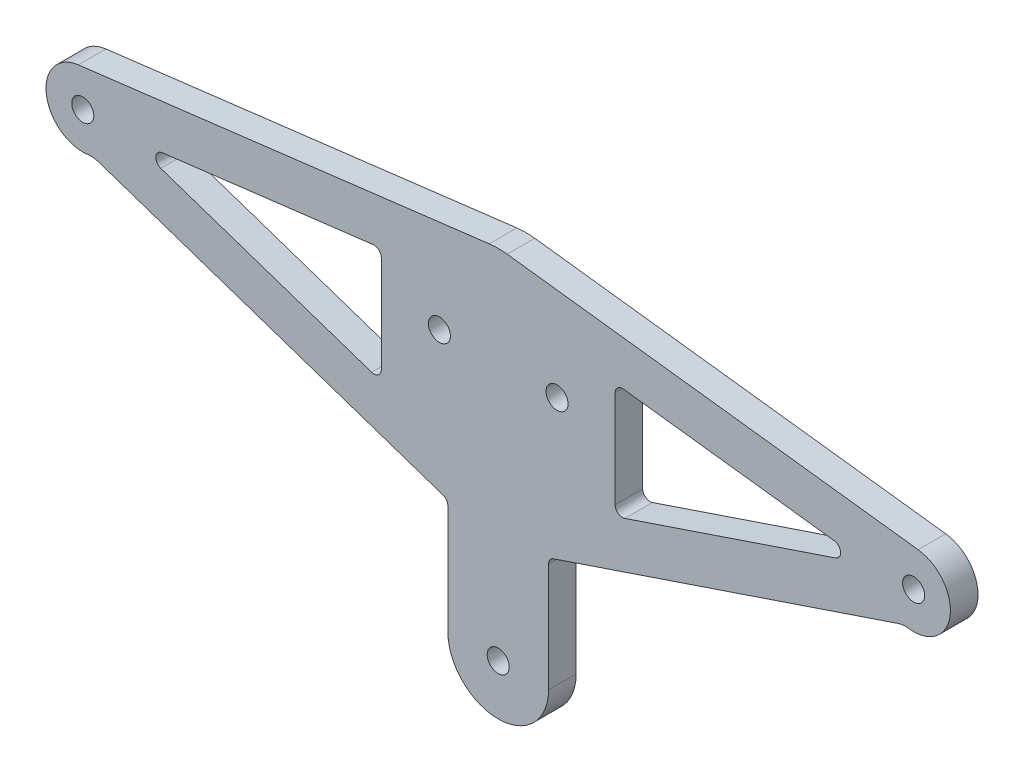
ISO-10303-21;
HEADER;
FILE_DESCRIPTION(('STEP AP214'),'2;1');
FILE_NAME('part.step','',(''),(''),'','','');
FILE_SCHEMA(('AUTOMOTIVE_DESIGN { 1 0 10303 214 1 1 1 1 }'));
ENDSEC;
DATA;
#1=APPLICATION_CONTEXT('core data for automotive mechanical design processes');
#2=APPLICATION_PROTOCOL_DEFINITION('international standard','automotive_design',2000,#1);
#3=PRODUCT_CONTEXT('',#1,'mechanical');
#4=PRODUCT('Part','Part','',(#3));
#5=PRODUCT_RELATED_PRODUCT_CATEGORY('part','',(#4));
#6=PRODUCT_DEFINITION_FORMATION('','',#4);
#7=PRODUCT_DEFINITION_CONTEXT('part definition',#1,'design');
#8=PRODUCT_DEFINITION('design','',#6,#7);
#9=PRODUCT_DEFINITION_SHAPE('','',#8);
#10=(LENGTH_UNIT() NAMED_UNIT(*) SI_UNIT(.MILLI.,.METRE.));
#11=(NAMED_UNIT(*) PLANE_ANGLE_UNIT() SI_UNIT($,.RADIAN.));
#12=(NAMED_UNIT(*) SI_UNIT($,.STERADIAN.) SOLID_ANGLE_UNIT());
#13=UNCERTAINTY_MEASURE_WITH_UNIT(LENGTH_MEASURE(1.E-05),#10,'distance_accuracy_value','');
#14=(GEOMETRIC_REPRESENTATION_CONTEXT(3) GLOBAL_UNCERTAINTY_ASSIGNED_CONTEXT((#13)) GLOBAL_UNIT_ASSIGNED_CONTEXT((#10,
#11,#12)) REPRESENTATION_CONTEXT('',''));
#15=CARTESIAN_POINT('',(0.,0.,0.));
#16=DIRECTION('',(0.,0.,1.));
#17=DIRECTION('',(1.,0.,0.));
#18=AXIS2_PLACEMENT_3D('',#15,#16,#17);
#19=CARTESIAN_POINT('',(113.,0.,3.75));
#20=DIRECTION('',(0.,0.,1.));
#21=DIRECTION('',(1.,0.,0.));
#22=AXIS2_PLACEMENT_3D('',#19,#20,#21);
#23=PLANE('',#22);
#24=CARTESIAN_POINT('',(64.5,-1.67512318169162,3.75));
#25=DIRECTION('',(0.,0.,1.));
#26=DIRECTION('',(1.,0.,0.));
#27=AXIS2_PLACEMENT_3D('',#24,#25,#26);
#28=CIRCLE('',#27,1.5);
#29=CARTESIAN_POINT('',(66.,-1.67512318169162,3.75));
#30=VERTEX_POINT('',#29);
#31=EDGE_CURVE('E364',#30,#30,#28,.T.);
#32=ORIENTED_EDGE('',*,*,#31,.F.);
#33=EDGE_LOOP('',(#32));
#34=FACE_BOUND('',#33,.T.);
#35=CARTESIAN_POINT('',(113.,0.,3.75));
#36=DIRECTION('',(0.,0.,1.));
#37=DIRECTION('',(1.,0.,0.));
#38=AXIS2_PLACEMENT_3D('',#35,#36,#37);
#39=CIRCLE('',#38,1.5);
#40=CARTESIAN_POINT('',(114.5,0.,3.75));
#41=VERTEX_POINT('',#40);
#42=EDGE_CURVE('E381',#41,#41,#39,.T.);
#43=ORIENTED_EDGE('',*,*,#42,.F.);
#44=EDGE_LOOP('',(#43));
#45=FACE_BOUND('',#44,.T.);
#46=DIRECTION('',(-0.992546151641322,0.121869343405148,0.));
#47=VECTOR('',#46,1.);
#48=CARTESIAN_POINT('',(56.5,11.9748768183084,3.75));
#49=LINE('',#48,#47);
#50=CARTESIAN_POINT('',(113.609346717026,4.96273075820661,3.75));
#51=VERTEX_POINT('',#50);
#52=CARTESIAN_POINT('',(57.7186934340515,11.8252400801331,3.75));
#53=VERTEX_POINT('',#52);
#54=EDGE_CURVE('E400',#51,#53,#49,.T.);
#55=ORIENTED_EDGE('',*,*,#54,.T.);
#56=CARTESIAN_POINT('',(56.5,1.89977856371989,3.75));
#57=DIRECTION('',(0.,0.,1.));
#58=DIRECTION('',(1.,0.,0.));
#59=AXIS2_PLACEMENT_3D('',#56,#57,#58);
#60=CIRCLE('',#59,10.);
#61=CARTESIAN_POINT('',(55.2813065659485,11.8252400801331,3.75));
#62=VERTEX_POINT('',#61);
#63=EDGE_CURVE('E11',#53,#62,#60,.T.);
#64=ORIENTED_EDGE('',*,*,#63,.T.);
#65=DIRECTION('',(-0.992546151641322,-0.121869343405148,0.));
#66=VECTOR('',#65,1.);
#67=CARTESIAN_POINT('',(56.5,11.9748768183084,3.75));
#68=LINE('',#67,#66);
#69=CARTESIAN_POINT('',(-0.60934671702574,4.96273075820661,3.75));
#70=VERTEX_POINT('',#69);
#71=EDGE_CURVE('E399',#62,#70,#68,.T.);
#72=ORIENTED_EDGE('',*,*,#71,.T.);
#73=CARTESIAN_POINT('',(0.,0.,3.75));
#74=DIRECTION('',(0.,0.,1.));
#75=DIRECTION('',(1.,0.,0.));
#76=AXIS2_PLACEMENT_3D('',#73,#74,#75);
#77=CIRCLE('',#76,5.);
#78=CARTESIAN_POINT('',(0.705001074709313,-4.95004782650215,3.75));
#79=VERTEX_POINT('',#78);
#80=EDGE_CURVE('E404',#70,#79,#77,.T.);
#81=ORIENTED_EDGE('',*,*,#80,.T.);
#82=CARTESIAN_POINT('',(1.1280017195349,-7.92007652240344,3.75));
#83=DIRECTION('',(0.,0.,-1.));
#84=DIRECTION('',(1.,0.,0.));
#85=AXIS2_PLACEMENT_3D('',#82,#83,#84);
#86=CIRCLE('',#85,3.);
#87=CARTESIAN_POINT('',(2.08707608684252,-5.07751142060305,3.75));
#88=VERTEX_POINT('',#87);
#89=EDGE_CURVE('E406',#79,#88,#86,.T.);
#90=ORIENTED_EDGE('',*,*,#89,.T.);
#91=DIRECTION('',(0.947521700600132,-0.319691455769206,0.));
#92=VECTOR('',#91,1.);
#93=CARTESIAN_POINT('',(48.9696914557692,-20.8955887776356,3.75));
#94=LINE('',#93,#92);
#95=CARTESIAN_POINT('',(48.9696914557692,-20.8955887776356,3.75));
#96=VERTEX_POINT('',#95);
#97=EDGE_CURVE('E407',#88,#96,#94,.T.);
#98=ORIENTED_EDGE('',*,*,#97,.T.);
#99=CARTESIAN_POINT('',(48.65,-21.8431104782357,3.75));
#100=DIRECTION('',(0.,0.,-1.));
#101=DIRECTION('',(1.,0.,0.));
#102=AXIS2_PLACEMENT_3D('',#99,#100,#101);
#103=CIRCLE('',#102,1.);
#104=CARTESIAN_POINT('',(49.65,-21.8431104782358,3.75));
#105=VERTEX_POINT('',#104);
#106=EDGE_CURVE('E413',#96,#105,#103,.T.);
#107=ORIENTED_EDGE('',*,*,#106,.T.);
#108=DIRECTION('',(0.,-1.,0.));
#109=VECTOR('',#108,1.);
#110=CARTESIAN_POINT('',(49.65,-36.6751231816916,3.75));
#111=LINE('',#110,#109);
#112=CARTESIAN_POINT('',(49.65,-36.6751231816916,3.75));
#113=VERTEX_POINT('',#112);
#114=EDGE_CURVE('E418',#105,#113,#111,.T.);
#115=ORIENTED_EDGE('',*,*,#114,.T.);
#116=CARTESIAN_POINT('',(56.5,-36.6751231816916,3.75));
#117=DIRECTION('',(0.,0.,1.));
#118=DIRECTION('',(1.,0.,0.));
#119=AXIS2_PLACEMENT_3D('',#116,#117,#118);
#120=CIRCLE('',#119,6.84999999999999);
#121=CARTESIAN_POINT('',(63.35,-36.6751231816916,3.75));
#122=VERTEX_POINT('',#121);
#123=EDGE_CURVE('E420',#113,#122,#120,.T.);
#124=ORIENTED_EDGE('',*,*,#123,.T.);
#125=DIRECTION('',(0.,1.,0.));
#126=VECTOR('',#125,1.);
#127=CARTESIAN_POINT('',(63.35,-36.6751231816916,3.75));
#128=LINE('',#127,#126);
#129=CARTESIAN_POINT('',(63.35,-21.8431104782358,3.75));
#130=VERTEX_POINT('',#129);
#131=EDGE_CURVE('E425',#122,#130,#128,.T.);
#132=ORIENTED_EDGE('',*,*,#131,.T.);
#133=CARTESIAN_POINT('',(64.35,-21.8431104782357,3.75));
#134=DIRECTION('',(0.,0.,-1.));
#135=DIRECTION('',(-1.,0.,0.));
#136=AXIS2_PLACEMENT_3D('',#133,#134,#135);
#137=CIRCLE('',#136,1.);
#138=CARTESIAN_POINT('',(64.0303085442308,-20.8955887776356,3.75));
#139=VERTEX_POINT('',#138);
#140=EDGE_CURVE('E422',#130,#139,#137,.T.);
#141=ORIENTED_EDGE('',*,*,#140,.T.);
#142=DIRECTION('',(0.947521700600132,0.319691455769206,0.));
#143=VECTOR('',#142,1.);
#144=CARTESIAN_POINT('',(64.0303085442308,-20.8955887776356,3.75));
#145=LINE('',#144,#143);
#146=CARTESIAN_POINT('',(110.912923913157,-5.07751142060305,3.75));
#147=VERTEX_POINT('',#146);
#148=EDGE_CURVE('E428',#139,#147,#145,.T.);
#149=ORIENTED_EDGE('',*,*,#148,.T.);
#150=CARTESIAN_POINT('',(111.871998280465,-7.92007652240344,3.75));
#151=DIRECTION('',(0.,0.,-1.));
#152=DIRECTION('',(-1.,0.,0.));
#153=AXIS2_PLACEMENT_3D('',#150,#151,#152);
#154=CIRCLE('',#153,3.);
#155=CARTESIAN_POINT('',(112.294998925291,-4.95004782650215,3.75));
#156=VERTEX_POINT('',#155);
#157=EDGE_CURVE('E431',#147,#156,#154,.T.);
#158=ORIENTED_EDGE('',*,*,#157,.T.);
#159=CARTESIAN_POINT('',(113.,0.,3.75));
#160=DIRECTION('',(0.,0.,1.));
#161=DIRECTION('',(1.,0.,0.));
#162=AXIS2_PLACEMENT_3D('',#159,#160,#161);
#163=CIRCLE('',#162,5.);
#164=EDGE_CURVE('E432',#156,#51,#163,.T.);
#165=ORIENTED_EDGE('',*,*,#164,.T.);
#166=EDGE_LOOP('',(#55,#64,#72,#81,#90,#98,#107,#115,#124,#132,#141,#149,#158,#165));
#167=FACE_BOUND('',#166,.T.);
#168=CARTESIAN_POINT('',(0.,0.,3.75));
#169=DIRECTION('',(0.,0.,1.));
#170=DIRECTION('',(1.,0.,0.));
#171=AXIS2_PLACEMENT_3D('',#168,#169,#170);
#172=CIRCLE('',#171,1.5);
#173=CARTESIAN_POINT('',(1.5,0.,3.75));
#174=VERTEX_POINT('',#173);
#175=EDGE_CURVE('E386',#174,#174,#172,.T.);
#176=ORIENTED_EDGE('',*,*,#175,.F.);
#177=EDGE_LOOP('',(#176));
#178=FACE_BOUND('',#177,.T.);
#179=CARTESIAN_POINT('',(48.5,-1.67512318169162,3.75));
#180=DIRECTION('',(0.,0.,1.));
#181=DIRECTION('',(1.,0.,0.));
#182=AXIS2_PLACEMENT_3D('',#179,#180,#181);
#183=CIRCLE('',#182,1.5);
#184=CARTESIAN_POINT('',(50.,-1.67512318169162,3.75));
#185=VERTEX_POINT('',#184);
#186=EDGE_CURVE('E373',#185,#185,#183,.T.);
#187=ORIENTED_EDGE('',*,*,#186,.F.);
#188=EDGE_LOOP('',(#187));
#189=FACE_BOUND('',#188,.T.);
#190=CARTESIAN_POINT('',(56.5,-36.6751231816916,3.75));
#191=DIRECTION('',(0.,0.,1.));
#192=DIRECTION('',(1.,0.,0.));
#193=AXIS2_PLACEMENT_3D('',#190,#191,#192);
#194=CIRCLE('',#193,1.5);
#195=CARTESIAN_POINT('',(58.,-36.6751231816916,3.75));
#196=VERTEX_POINT('',#195);
#197=EDGE_CURVE('E360',#196,#196,#194,.T.);
#198=ORIENTED_EDGE('',*,*,#197,.F.);
#199=EDGE_LOOP('',(#198));
#200=FACE_BOUND('',#199,.T.);
#201=DIRECTION('',(-0.992546151641322,0.121869343405148,0.));
#202=VECTOR('',#201,1.);
#203=CARTESIAN_POINT('',(73.5218693434051,3.83979511247867,3.75));
#204=LINE('',#203,#202);
#205=CARTESIAN_POINT('',(102.19276870693,0.319451323436879,3.75));
#206=VERTEX_POINT('',#205);
#207=CARTESIAN_POINT('',(73.5218693434051,3.83979511247867,3.75));
#208=VERTEX_POINT('',#207);
#209=EDGE_CURVE('E296',#206,#208,#204,.T.);
#210=ORIENTED_EDGE('',*,*,#209,.F.);
#211=CARTESIAN_POINT('',(102.070899363525,-0.673094828204451,3.75));
#212=DIRECTION('',(0.,0.,1.));
#213=DIRECTION('',(-1.,0.,0.));
#214=AXIS2_PLACEMENT_3D('',#211,#212,#213);
#215=CIRCLE('',#214,1.);
#216=CARTESIAN_POINT('',(102.390590819294,-1.62061652880461,3.75));
#217=VERTEX_POINT('',#216);
#218=EDGE_CURVE('E294',#217,#206,#215,.T.);
#219=ORIENTED_EDGE('',*,*,#218,.F.);
#220=DIRECTION('',(0.947521700600132,0.319691455769206,0.));
#221=VECTOR('',#220,1.);
#222=CARTESIAN_POINT('',(73.7196914557692,-11.2941063812611,3.75));
#223=LINE('',#222,#221);
#224=CARTESIAN_POINT('',(73.7196914557692,-11.2941063812611,3.75));
#225=VERTEX_POINT('',#224);
#226=EDGE_CURVE('E313',#225,#217,#223,.T.);
#227=ORIENTED_EDGE('',*,*,#226,.F.);
#228=CARTESIAN_POINT('',(73.4,-10.346584680661,3.75));
#229=DIRECTION('',(0.,0.,1.));
#230=DIRECTION('',(1.,0.,0.));
#231=AXIS2_PLACEMENT_3D('',#228,#229,#230);
#232=CIRCLE('',#231,1.);
#233=CARTESIAN_POINT('',(72.4,-10.346584680661,3.75));
#234=VERTEX_POINT('',#233);
#235=EDGE_CURVE('E307',#234,#225,#232,.T.);
#236=ORIENTED_EDGE('',*,*,#235,.F.);
#237=DIRECTION('',(0.,-1.,0.));
#238=VECTOR('',#237,1.);
#239=CARTESIAN_POINT('',(72.4,2.84724896083734,3.75));
#240=LINE('',#239,#238);
#241=CARTESIAN_POINT('',(72.4,2.84724896083734,3.75));
#242=VERTEX_POINT('',#241);
#243=EDGE_CURVE('E302',#242,#234,#240,.T.);
#244=ORIENTED_EDGE('',*,*,#243,.F.);
#245=CARTESIAN_POINT('',(73.4,2.84724896083735,3.75));
#246=DIRECTION('',(0.,0.,1.));
#247=DIRECTION('',(-1.,0.,0.));
#248=AXIS2_PLACEMENT_3D('',#245,#246,#247);
#249=CIRCLE('',#248,1.);
#250=EDGE_CURVE('E301',#208,#242,#249,.T.);
#251=ORIENTED_EDGE('',*,*,#250,.F.);
#252=EDGE_LOOP('',(#210,#219,#227,#236,#244,#251));
#253=FACE_BOUND('',#252,.T.);
#254=DIRECTION('',(0.,1.,0.));
#255=VECTOR('',#254,1.);
#256=CARTESIAN_POINT('',(40.6,2.84724896083734,3.75));
#257=LINE('',#256,#255);
#258=CARTESIAN_POINT('',(40.6,-10.346584680661,3.75));
#259=VERTEX_POINT('',#258);
#260=CARTESIAN_POINT('',(40.6,2.84724896083734,3.75));
#261=VERTEX_POINT('',#260);
#262=EDGE_CURVE('E231',#259,#261,#257,.T.);
#263=ORIENTED_EDGE('',*,*,#262,.F.);
#264=CARTESIAN_POINT('',(39.6,-10.346584680661,3.75));
#265=DIRECTION('',(0.,0.,1.));
#266=DIRECTION('',(-1.,0.,0.));
#267=AXIS2_PLACEMENT_3D('',#264,#265,#266);
#268=CIRCLE('',#267,1.);
#269=CARTESIAN_POINT('',(39.2803085442308,-11.2941063812611,3.75));
#270=VERTEX_POINT('',#269);
#271=EDGE_CURVE('E219',#270,#259,#268,.T.);
#272=ORIENTED_EDGE('',*,*,#271,.F.);
#273=DIRECTION('',(0.947521700600132,-0.319691455769206,0.));
#274=VECTOR('',#273,1.);
#275=CARTESIAN_POINT('',(39.2803085442308,-11.2941063812611,3.75));
#276=LINE('',#275,#274);
#277=CARTESIAN_POINT('',(10.6094091807058,-1.62061652880462,3.75));
#278=VERTEX_POINT('',#277);
#279=EDGE_CURVE('E256',#278,#270,#276,.T.);
#280=ORIENTED_EDGE('',*,*,#279,.F.);
#281=CARTESIAN_POINT('',(10.929100636475,-0.673094828204463,3.75));
#282=DIRECTION('',(0.,0.,1.));
#283=DIRECTION('',(1.,0.,0.));
#284=AXIS2_PLACEMENT_3D('',#281,#282,#283);
#285=CIRCLE('',#284,1.);
#286=CARTESIAN_POINT('',(10.8072312930699,0.319451323436868,3.75));
#287=VERTEX_POINT('',#286);
#288=EDGE_CURVE('E255',#287,#278,#285,.T.);
#289=ORIENTED_EDGE('',*,*,#288,.F.);
#290=DIRECTION('',(-0.992546151641322,-0.121869343405148,0.));
#291=VECTOR('',#290,1.);
#292=CARTESIAN_POINT('',(39.4781306565948,3.83979511247866,3.75));
#293=LINE('',#292,#291);
#294=CARTESIAN_POINT('',(39.4781306565948,3.83979511247866,3.75));
#295=VERTEX_POINT('',#294);
#296=EDGE_CURVE('E247',#295,#287,#293,.T.);
#297=ORIENTED_EDGE('',*,*,#296,.F.);
#298=CARTESIAN_POINT('',(39.6,2.84724896083734,3.75));
#299=DIRECTION('',(0.,0.,1.));
#300=DIRECTION('',(1.,0.,0.));
#301=AXIS2_PLACEMENT_3D('',#298,#299,#300);
#302=CIRCLE('',#301,1.);
#303=EDGE_CURVE('E242',#261,#295,#302,.T.);
#304=ORIENTED_EDGE('',*,*,#303,.F.);
#305=EDGE_LOOP('',(#263,#272,#280,#289,#297,#304));
#306=FACE_BOUND('',#305,.T.);
#307=ADVANCED_FACE('F44',(#34,#45,#167,#178,#189,#200,#253,#306),#23,.T.);
#308=CARTESIAN_POINT('',(113.,0.,0.));
#309=DIRECTION('',(0.,0.,1.));
#310=DIRECTION('',(1.,0.,0.));
#311=AXIS2_PLACEMENT_3D('',#308,#309,#310);
#312=PLANE('',#311);
#313=CARTESIAN_POINT('',(102.070899363525,-0.673094828204451,0.));
#314=DIRECTION('',(0.,0.,1.));
#315=DIRECTION('',(-1.,0.,0.));
#316=AXIS2_PLACEMENT_3D('',#313,#314,#315);
#317=CIRCLE('',#316,1.);
#318=CARTESIAN_POINT('',(102.390590819294,-1.6206165288046,0.));
#319=VERTEX_POINT('',#318);
#320=CARTESIAN_POINT('',(102.19276870693,0.319451323436879,0.));
#321=VERTEX_POINT('',#320);
#322=EDGE_CURVE('E238',#319,#321,#317,.T.);
#323=ORIENTED_EDGE('',*,*,#322,.T.);
#324=DIRECTION('',(-0.992546151641322,0.121869343405148,0.));
#325=VECTOR('',#324,1.);
#326=CARTESIAN_POINT('',(73.5218693434051,3.83979511247867,0.));
#327=LINE('',#326,#325);
#328=CARTESIAN_POINT('',(73.5218693434051,3.83979511247867,0.));
#329=VERTEX_POINT('',#328);
#330=EDGE_CURVE('E318',#321,#329,#327,.T.);
#331=ORIENTED_EDGE('',*,*,#330,.T.);
#332=CARTESIAN_POINT('',(73.4,2.84724896083735,0.));
#333=DIRECTION('',(0.,0.,1.));
#334=DIRECTION('',(-1.,0.,0.));
#335=AXIS2_PLACEMENT_3D('',#332,#333,#334);
#336=CIRCLE('',#335,1.);
#337=CARTESIAN_POINT('',(72.4,2.84724896083734,0.));
#338=VERTEX_POINT('',#337);
#339=EDGE_CURVE('E325',#329,#338,#336,.T.);
#340=ORIENTED_EDGE('',*,*,#339,.T.);
#341=DIRECTION('',(0.,-1.,0.));
#342=VECTOR('',#341,1.);
#343=CARTESIAN_POINT('',(72.4,2.84724896083734,0.));
#344=LINE('',#343,#342);
#345=CARTESIAN_POINT('',(72.4,-10.346584680661,0.));
#346=VERTEX_POINT('',#345);
#347=EDGE_CURVE('E326',#338,#346,#344,.T.);
#348=ORIENTED_EDGE('',*,*,#347,.T.);
#349=CARTESIAN_POINT('',(73.4,-10.346584680661,0.));
#350=DIRECTION('',(0.,0.,1.));
#351=DIRECTION('',(1.,0.,0.));
#352=AXIS2_PLACEMENT_3D('',#349,#350,#351);
#353=CIRCLE('',#352,1.);
#354=CARTESIAN_POINT('',(73.7196914557692,-11.2941063812611,0.));
#355=VERTEX_POINT('',#354);
#356=EDGE_CURVE('E329',#346,#355,#353,.T.);
#357=ORIENTED_EDGE('',*,*,#356,.T.);
#358=DIRECTION('',(0.947521700600132,0.319691455769206,0.));
#359=VECTOR('',#358,1.);
#360=CARTESIAN_POINT('',(73.7196914557692,-11.2941063812611,0.));
#361=LINE('',#360,#359);
#362=EDGE_CURVE('E300',#355,#319,#361,.T.);
#363=ORIENTED_EDGE('',*,*,#362,.T.);
#364=EDGE_LOOP('',(#323,#331,#340,#348,#357,#363));
#365=FACE_BOUND('',#364,.T.);
#366=DIRECTION('',(-0.992546151641322,-0.121869343405148,0.));
#367=VECTOR('',#366,1.);
#368=CARTESIAN_POINT('',(56.5,11.9748768183084,0.));
#369=LINE('',#368,#367);
#370=CARTESIAN_POINT('',(55.2813065659485,11.8252400801331,0.));
#371=VERTEX_POINT('',#370);
#372=CARTESIAN_POINT('',(-0.60934671702574,4.96273075820661,0.));
#373=VERTEX_POINT('',#372);
#374=EDGE_CURVE('E439',#371,#373,#369,.T.);
#375=ORIENTED_EDGE('',*,*,#374,.F.);
#376=CARTESIAN_POINT('',(56.5,1.89977856371989,0.));
#377=DIRECTION('',(0.,0.,1.));
#378=DIRECTION('',(1.,0.,0.));
#379=AXIS2_PLACEMENT_3D('',#376,#377,#378);
#380=CIRCLE('',#379,10.);
#381=CARTESIAN_POINT('',(57.7186934340515,11.8252400801331,0.));
#382=VERTEX_POINT('',#381);
#383=EDGE_CURVE('E68',#371,#382,#380,.F.);
#384=ORIENTED_EDGE('',*,*,#383,.T.);
#385=DIRECTION('',(-0.992546151641322,0.121869343405148,0.));
#386=VECTOR('',#385,1.);
#387=CARTESIAN_POINT('',(56.5,11.9748768183084,0.));
#388=LINE('',#387,#386);
#389=CARTESIAN_POINT('',(113.609346717026,4.96273075820661,0.));
#390=VERTEX_POINT('',#389);
#391=EDGE_CURVE('E395',#390,#382,#388,.T.);
#392=ORIENTED_EDGE('',*,*,#391,.F.);
#393=CARTESIAN_POINT('',(113.,0.,0.));
#394=DIRECTION('',(0.,0.,1.));
#395=DIRECTION('',(1.,0.,0.));
#396=AXIS2_PLACEMENT_3D('',#393,#394,#395);
#397=CIRCLE('',#396,5.);
#398=CARTESIAN_POINT('',(112.294998925291,-4.95004782650215,0.));
#399=VERTEX_POINT('',#398);
#400=EDGE_CURVE('E402',#399,#390,#397,.T.);
#401=ORIENTED_EDGE('',*,*,#400,.F.);
#402=CARTESIAN_POINT('',(111.871998280465,-7.92007652240344,0.));
#403=DIRECTION('',(0.,0.,-1.));
#404=DIRECTION('',(-1.,0.,0.));
#405=AXIS2_PLACEMENT_3D('',#402,#403,#404);
#406=CIRCLE('',#405,3.);
#407=CARTESIAN_POINT('',(110.912923913157,-5.07751142060305,0.));
#408=VERTEX_POINT('',#407);
#409=EDGE_CURVE('E469',#408,#399,#406,.T.);
#410=ORIENTED_EDGE('',*,*,#409,.F.);
#411=DIRECTION('',(0.947521700600132,0.319691455769206,0.));
#412=VECTOR('',#411,1.);
#413=CARTESIAN_POINT('',(64.0303085442308,-20.8955887776356,0.));
#414=LINE('',#413,#412);
#415=CARTESIAN_POINT('',(64.0303085442308,-20.8955887776356,0.));
#416=VERTEX_POINT('',#415);
#417=EDGE_CURVE('E470',#416,#408,#414,.T.);
#418=ORIENTED_EDGE('',*,*,#417,.F.);
#419=CARTESIAN_POINT('',(64.35,-21.8431104782357,0.));
#420=DIRECTION('',(0.,0.,-1.));
#421=DIRECTION('',(-1.,0.,0.));
#422=AXIS2_PLACEMENT_3D('',#419,#420,#421);
#423=CIRCLE('',#422,1.);
#424=CARTESIAN_POINT('',(63.35,-21.8431104782358,0.));
#425=VERTEX_POINT('',#424);
#426=EDGE_CURVE('E463',#425,#416,#423,.T.);
#427=ORIENTED_EDGE('',*,*,#426,.F.);
#428=DIRECTION('',(0.,1.,0.));
#429=VECTOR('',#428,1.);
#430=CARTESIAN_POINT('',(63.35,-36.6751231816916,0.));
#431=LINE('',#430,#429);
#432=CARTESIAN_POINT('',(63.35,-36.6751231816916,0.));
#433=VERTEX_POINT('',#432);
#434=EDGE_CURVE('E464',#433,#425,#431,.T.);
#435=ORIENTED_EDGE('',*,*,#434,.F.);
#436=CARTESIAN_POINT('',(56.5,-36.6751231816916,0.));
#437=DIRECTION('',(0.,0.,1.));
#438=DIRECTION('',(1.,0.,0.));
#439=AXIS2_PLACEMENT_3D('',#436,#437,#438);
#440=CIRCLE('',#439,6.84999999999999);
#441=CARTESIAN_POINT('',(49.65,-36.6751231816916,0.));
#442=VERTEX_POINT('',#441);
#443=EDGE_CURVE('E456',#442,#433,#440,.T.);
#444=ORIENTED_EDGE('',*,*,#443,.F.);
#445=DIRECTION('',(0.,-1.,0.));
#446=VECTOR('',#445,1.);
#447=CARTESIAN_POINT('',(49.65,-36.6751231816916,0.));
#448=LINE('',#447,#446);
#449=CARTESIAN_POINT('',(49.65,-21.8431104782358,0.));
#450=VERTEX_POINT('',#449);
#451=EDGE_CURVE('E454',#450,#442,#448,.T.);
#452=ORIENTED_EDGE('',*,*,#451,.F.);
#453=CARTESIAN_POINT('',(48.65,-21.8431104782357,0.));
#454=DIRECTION('',(0.,0.,-1.));
#455=DIRECTION('',(1.,0.,0.));
#456=AXIS2_PLACEMENT_3D('',#453,#454,#455);
#457=CIRCLE('',#456,1.);
#458=CARTESIAN_POINT('',(48.9696914557692,-20.8955887776356,0.));
#459=VERTEX_POINT('',#458);
#460=EDGE_CURVE('E455',#459,#450,#457,.T.);
#461=ORIENTED_EDGE('',*,*,#460,.F.);
#462=DIRECTION('',(0.947521700600132,-0.319691455769206,0.));
#463=VECTOR('',#462,1.);
#464=CARTESIAN_POINT('',(48.9696914557692,-20.8955887776356,0.));
#465=LINE('',#464,#463);
#466=CARTESIAN_POINT('',(2.08707608684252,-5.07751142060305,0.));
#467=VERTEX_POINT('',#466);
#468=EDGE_CURVE('E448',#467,#459,#465,.T.);
#469=ORIENTED_EDGE('',*,*,#468,.F.);
#470=CARTESIAN_POINT('',(1.1280017195349,-7.92007652240344,0.));
#471=DIRECTION('',(0.,0.,-1.));
#472=DIRECTION('',(1.,0.,0.));
#473=AXIS2_PLACEMENT_3D('',#470,#471,#472);
#474=CIRCLE('',#473,3.);
#475=CARTESIAN_POINT('',(0.705001074709313,-4.95004782650215,0.));
#476=VERTEX_POINT('',#475);
#477=EDGE_CURVE('E449',#476,#467,#474,.T.);
#478=ORIENTED_EDGE('',*,*,#477,.F.);
#479=CARTESIAN_POINT('',(0.,0.,0.));
#480=DIRECTION('',(0.,0.,1.));
#481=DIRECTION('',(1.,0.,0.));
#482=AXIS2_PLACEMENT_3D('',#479,#480,#481);
#483=CIRCLE('',#482,5.);
#484=EDGE_CURVE('E444',#373,#476,#483,.T.);
#485=ORIENTED_EDGE('',*,*,#484,.F.);
#486=EDGE_LOOP('',(#375,#384,#392,#401,#410,#418,#427,#435,#444,#452,#461,#469,#478,#485));
#487=FACE_BOUND('',#486,.T.);
#488=CARTESIAN_POINT('',(0.,0.,0.));
#489=DIRECTION('',(0.,0.,1.));
#490=DIRECTION('',(1.,0.,0.));
#491=AXIS2_PLACEMENT_3D('',#488,#489,#490);
#492=CIRCLE('',#491,1.5);
#493=CARTESIAN_POINT('',(1.5,0.,0.));
#494=VERTEX_POINT('',#493);
#495=EDGE_CURVE('E384',#494,#494,#492,.T.);
#496=ORIENTED_EDGE('',*,*,#495,.T.);
#497=EDGE_LOOP('',(#496));
#498=FACE_BOUND('',#497,.T.);
#499=CARTESIAN_POINT('',(113.,0.,0.));
#500=DIRECTION('',(0.,0.,1.));
#501=DIRECTION('',(1.,0.,0.));
#502=AXIS2_PLACEMENT_3D('',#499,#500,#501);
#503=CIRCLE('',#502,1.5);
#504=CARTESIAN_POINT('',(114.5,0.,0.));
#505=VERTEX_POINT('',#504);
#506=EDGE_CURVE('E380',#505,#505,#503,.T.);
#507=ORIENTED_EDGE('',*,*,#506,.T.);
#508=EDGE_LOOP('',(#507));
#509=FACE_BOUND('',#508,.T.);
#510=CARTESIAN_POINT('',(48.5,-1.67512318169162,0.));
#511=DIRECTION('',(0.,0.,1.));
#512=DIRECTION('',(1.,0.,0.));
#513=AXIS2_PLACEMENT_3D('',#510,#511,#512);
#514=CIRCLE('',#513,1.5);
#515=CARTESIAN_POINT('',(50.,-1.67512318169162,0.));
#516=VERTEX_POINT('',#515);
#517=EDGE_CURVE('E369',#516,#516,#514,.T.);
#518=ORIENTED_EDGE('',*,*,#517,.T.);
#519=EDGE_LOOP('',(#518));
#520=FACE_BOUND('',#519,.T.);
#521=CARTESIAN_POINT('',(64.5,-1.67512318169162,0.));
#522=DIRECTION('',(0.,0.,1.));
#523=DIRECTION('',(1.,0.,0.));
#524=AXIS2_PLACEMENT_3D('',#521,#522,#523);
#525=CIRCLE('',#524,1.5);
#526=CARTESIAN_POINT('',(66.,-1.67512318169162,0.));
#527=VERTEX_POINT('',#526);
#528=EDGE_CURVE('E363',#527,#527,#525,.T.);
#529=ORIENTED_EDGE('',*,*,#528,.T.);
#530=EDGE_LOOP('',(#529));
#531=FACE_BOUND('',#530,.T.);
#532=CARTESIAN_POINT('',(56.5,-36.6751231816916,0.));
#533=DIRECTION('',(0.,0.,1.));
#534=DIRECTION('',(1.,0.,0.));
#535=AXIS2_PLACEMENT_3D('',#532,#533,#534);
#536=CIRCLE('',#535,1.5);
#537=CARTESIAN_POINT('',(58.,-36.6751231816916,0.));
#538=VERTEX_POINT('',#537);
#539=EDGE_CURVE('E356',#538,#538,#536,.T.);
#540=ORIENTED_EDGE('',*,*,#539,.T.);
#541=EDGE_LOOP('',(#540));
#542=FACE_BOUND('',#541,.T.);
#543=CARTESIAN_POINT('',(39.6,-10.346584680661,0.));
#544=DIRECTION('',(0.,0.,1.));
#545=DIRECTION('',(-1.,0.,0.));
#546=AXIS2_PLACEMENT_3D('',#543,#544,#545);
#547=CIRCLE('',#546,1.);
#548=CARTESIAN_POINT('',(39.2803085442308,-11.2941063812611,0.));
#549=VERTEX_POINT('',#548);
#550=CARTESIAN_POINT('',(40.6,-10.346584680661,0.));
#551=VERTEX_POINT('',#550);
#552=EDGE_CURVE('E261',#549,#551,#547,.T.);
#553=ORIENTED_EDGE('',*,*,#552,.T.);
#554=DIRECTION('',(0.,1.,0.));
#555=VECTOR('',#554,1.);
#556=CARTESIAN_POINT('',(40.6,2.84724896083734,0.));
#557=LINE('',#556,#555);
#558=CARTESIAN_POINT('',(40.6,2.84724896083734,0.));
#559=VERTEX_POINT('',#558);
#560=EDGE_CURVE('E236',#551,#559,#557,.T.);
#561=ORIENTED_EDGE('',*,*,#560,.T.);
#562=CARTESIAN_POINT('',(39.6,2.84724896083734,0.));
#563=DIRECTION('',(0.,0.,1.));
#564=DIRECTION('',(1.,0.,0.));
#565=AXIS2_PLACEMENT_3D('',#562,#563,#564);
#566=CIRCLE('',#565,1.);
#567=CARTESIAN_POINT('',(39.4781306565948,3.83979511247866,0.));
#568=VERTEX_POINT('',#567);
#569=EDGE_CURVE('E266',#559,#568,#566,.T.);
#570=ORIENTED_EDGE('',*,*,#569,.T.);
#571=DIRECTION('',(-0.992546151641322,-0.121869343405148,0.));
#572=VECTOR('',#571,1.);
#573=CARTESIAN_POINT('',(39.4781306565948,3.83979511247866,0.));
#574=LINE('',#573,#572);
#575=CARTESIAN_POINT('',(10.8072312930699,0.319451323436868,0.));
#576=VERTEX_POINT('',#575);
#577=EDGE_CURVE('E269',#568,#576,#574,.T.);
#578=ORIENTED_EDGE('',*,*,#577,.T.);
#579=CARTESIAN_POINT('',(10.929100636475,-0.673094828204463,0.));
#580=DIRECTION('',(0.,0.,1.));
#581=DIRECTION('',(1.,0.,0.));
#582=AXIS2_PLACEMENT_3D('',#579,#580,#581);
#583=CIRCLE('',#582,1.);
#584=CARTESIAN_POINT('',(10.6094091807058,-1.62061652880462,0.));
#585=VERTEX_POINT('',#584);
#586=EDGE_CURVE('E273',#576,#585,#583,.T.);
#587=ORIENTED_EDGE('',*,*,#586,.T.);
#588=DIRECTION('',(0.947521700600132,-0.319691455769206,0.));
#589=VECTOR('',#588,1.);
#590=CARTESIAN_POINT('',(39.2803085442308,-11.2941063812611,0.));
#591=LINE('',#590,#589);
#592=EDGE_CURVE('E235',#585,#549,#591,.T.);
#593=ORIENTED_EDGE('',*,*,#592,.T.);
#594=EDGE_LOOP('',(#553,#561,#570,#578,#587,#593));
#595=FACE_BOUND('',#594,.T.);
#596=ADVANCED_FACE('F536',(#365,#487,#498,#509,#520,#531,#542,#595),#312,.F.);
#597=CARTESIAN_POINT('',(56.5,11.9748768183084,3.75));
#598=DIRECTION('',(-0.121869343405148,-0.992546151641322,0.));
#599=DIRECTION('',(0.992546151641322,-0.121869343405148,0.));
#600=AXIS2_PLACEMENT_3D('',#597,#598,#599);
#601=PLANE('',#600);
#602=ORIENTED_EDGE('',*,*,#391,.T.);
#603=DIRECTION('',(0.,0.,-1.));
#604=VECTOR('',#603,1.);
#605=CARTESIAN_POINT('',(57.7186934340515,11.8252400801331,3.75));
#606=LINE('',#605,#604);
#607=EDGE_CURVE('E53',#382,#53,#606,.F.);
#608=ORIENTED_EDGE('',*,*,#607,.T.);
#609=ORIENTED_EDGE('',*,*,#54,.F.);
#610=DIRECTION('',(0.,0.,-1.));
#611=VECTOR('',#610,1.);
#612=CARTESIAN_POINT('',(113.609346717026,4.96273075820661,3.75));
#613=LINE('',#612,#611);
#614=EDGE_CURVE('E440',#51,#390,#613,.T.);
#615=ORIENTED_EDGE('',*,*,#614,.T.);
#616=EDGE_LOOP('',(#602,#608,#609,#615));
#617=FACE_BOUND('',#616,.T.);
#618=ADVANCED_FACE('F570',(#617),#601,.F.);
#619=CARTESIAN_POINT('',(56.5,11.9748768183084,3.75));
#620=DIRECTION('',(0.121869343405148,-0.992546151641322,0.));
#621=DIRECTION('',(0.992546151641322,0.121869343405148,0.));
#622=AXIS2_PLACEMENT_3D('',#619,#620,#621);
#623=PLANE('',#622);
#624=ORIENTED_EDGE('',*,*,#71,.F.);
#625=DIRECTION('',(0.,0.,-1.));
#626=VECTOR('',#625,1.);
#627=CARTESIAN_POINT('',(55.2813065659485,11.8252400801331,3.75));
#628=LINE('',#627,#626);
#629=EDGE_CURVE('E525',#62,#371,#628,.T.);
#630=ORIENTED_EDGE('',*,*,#629,.T.);
#631=ORIENTED_EDGE('',*,*,#374,.T.);
#632=DIRECTION('',(0.,0.,-1.));
#633=VECTOR('',#632,1.);
#634=CARTESIAN_POINT('',(-0.60934671702574,4.96273075820661,3.75));
#635=LINE('',#634,#633);
#636=EDGE_CURVE('E520',#70,#373,#635,.T.);
#637=ORIENTED_EDGE('',*,*,#636,.F.);
#638=EDGE_LOOP('',(#624,#630,#631,#637));
#639=FACE_BOUND('',#638,.T.);
#640=ADVANCED_FACE('F533',(#639),#623,.F.);
#641=CARTESIAN_POINT('',(0.,0.,3.75));
#642=DIRECTION('',(0.,0.,-1.));
#643=DIRECTION('',(-1.,0.,0.));
#644=AXIS2_PLACEMENT_3D('',#641,#642,#643);
#645=CYLINDRICAL_SURFACE('',#644,5.);
#646=ORIENTED_EDGE('',*,*,#484,.T.);
#647=DIRECTION('',(0.,0.,-1.));
#648=VECTOR('',#647,1.);
#649=CARTESIAN_POINT('',(0.705001074709313,-4.95004782650215,3.75));
#650=LINE('',#649,#648);
#651=EDGE_CURVE('E514',#79,#476,#650,.T.);
#652=ORIENTED_EDGE('',*,*,#651,.F.);
#653=ORIENTED_EDGE('',*,*,#80,.F.);
#654=ORIENTED_EDGE('',*,*,#636,.T.);
#655=EDGE_LOOP('',(#646,#652,#653,#654));
#656=FACE_BOUND('',#655,.T.);
#657=ADVANCED_FACE('F545',(#656),#645,.T.);
#658=CARTESIAN_POINT('',(1.1280017195349,-7.92007652240344,3.75));
#659=DIRECTION('',(0.,0.,-1.));
#660=DIRECTION('',(-1.,0.,0.));
#661=AXIS2_PLACEMENT_3D('',#658,#659,#660);
#662=CYLINDRICAL_SURFACE('',#661,3.);
#663=ORIENTED_EDGE('',*,*,#477,.T.);
#664=DIRECTION('',(0.,0.,-1.));
#665=VECTOR('',#664,1.);
#666=CARTESIAN_POINT('',(2.08707608684252,-5.07751142060305,3.75));
#667=LINE('',#666,#665);
#668=EDGE_CURVE('E509',#88,#467,#667,.T.);
#669=ORIENTED_EDGE('',*,*,#668,.F.);
#670=ORIENTED_EDGE('',*,*,#89,.F.);
#671=ORIENTED_EDGE('',*,*,#651,.T.);
#672=EDGE_LOOP('',(#663,#669,#670,#671));
#673=FACE_BOUND('',#672,.T.);
#674=ADVANCED_FACE('F546',(#673),#662,.F.);
#675=CARTESIAN_POINT('',(48.9696914557692,-20.8955887776356,3.75));
#676=DIRECTION('',(0.319691455769206,0.947521700600132,0.));
#677=DIRECTION('',(-0.947521700600132,0.319691455769206,0.));
#678=AXIS2_PLACEMENT_3D('',#675,#676,#677);
#679=PLANE('',#678);
#680=ORIENTED_EDGE('',*,*,#468,.T.);
#681=DIRECTION('',(0.,0.,-1.));
#682=VECTOR('',#681,1.);
#683=CARTESIAN_POINT('',(48.9696914557692,-20.8955887776356,3.75));
#684=LINE('',#683,#682);
#685=EDGE_CURVE('E506',#96,#459,#684,.T.);
#686=ORIENTED_EDGE('',*,*,#685,.F.);
#687=ORIENTED_EDGE('',*,*,#97,.F.);
#688=ORIENTED_EDGE('',*,*,#668,.T.);
#689=EDGE_LOOP('',(#680,#686,#687,#688));
#690=FACE_BOUND('',#689,.T.);
#691=ADVANCED_FACE('F610',(#690),#679,.F.);
#692=CARTESIAN_POINT('',(48.65,-21.8431104782357,3.75));
#693=DIRECTION('',(0.,0.,-1.));
#694=DIRECTION('',(-1.,0.,0.));
#695=AXIS2_PLACEMENT_3D('',#692,#693,#694);
#696=CYLINDRICAL_SURFACE('',#695,1.);
#697=ORIENTED_EDGE('',*,*,#460,.T.);
#698=DIRECTION('',(0.,0.,-1.));
#699=VECTOR('',#698,1.);
#700=CARTESIAN_POINT('',(49.65,-21.8431104782358,3.75));
#701=LINE('',#700,#699);
#702=EDGE_CURVE('E501',#105,#450,#701,.T.);
#703=ORIENTED_EDGE('',*,*,#702,.F.);
#704=ORIENTED_EDGE('',*,*,#106,.F.);
#705=ORIENTED_EDGE('',*,*,#685,.T.);
#706=EDGE_LOOP('',(#697,#703,#704,#705));
#707=FACE_BOUND('',#706,.T.);
#708=ADVANCED_FACE('F602',(#707),#696,.F.);
#709=CARTESIAN_POINT('',(49.65,-36.6751231816916,3.75));
#710=DIRECTION('',(1.,0.,0.));
#711=DIRECTION('',(0.,1.,0.));
#712=AXIS2_PLACEMENT_3D('',#709,#710,#711);
#713=PLANE('',#712);
#714=ORIENTED_EDGE('',*,*,#451,.T.);
#715=DIRECTION('',(0.,0.,-1.));
#716=VECTOR('',#715,1.);
#717=CARTESIAN_POINT('',(49.65,-36.6751231816916,3.75));
#718=LINE('',#717,#716);
#719=EDGE_CURVE('E499',#113,#442,#718,.T.);
#720=ORIENTED_EDGE('',*,*,#719,.F.);
#721=ORIENTED_EDGE('',*,*,#114,.F.);
#722=ORIENTED_EDGE('',*,*,#702,.T.);
#723=EDGE_LOOP('',(#714,#720,#721,#722));
#724=FACE_BOUND('',#723,.T.);
#725=ADVANCED_FACE('F597',(#724),#713,.F.);
#726=CARTESIAN_POINT('',(56.5,-36.6751231816916,3.75));
#727=DIRECTION('',(0.,0.,-1.));
#728=DIRECTION('',(-1.,0.,0.));
#729=AXIS2_PLACEMENT_3D('',#726,#727,#728);
#730=CYLINDRICAL_SURFACE('',#729,6.84999999999999);
#731=ORIENTED_EDGE('',*,*,#443,.T.);
#732=DIRECTION('',(0.,0.,-1.));
#733=VECTOR('',#732,1.);
#734=CARTESIAN_POINT('',(63.35,-36.6751231816916,3.75));
#735=LINE('',#734,#733);
#736=EDGE_CURVE('E493',#122,#433,#735,.T.);
#737=ORIENTED_EDGE('',*,*,#736,.F.);
#738=ORIENTED_EDGE('',*,*,#123,.F.);
#739=ORIENTED_EDGE('',*,*,#719,.T.);
#740=EDGE_LOOP('',(#731,#737,#738,#739));
#741=FACE_BOUND('',#740,.T.);
#742=ADVANCED_FACE('F594',(#741),#730,.T.);
#743=CARTESIAN_POINT('',(63.35,-36.6751231816916,3.75));
#744=DIRECTION('',(-1.,0.,0.));
#745=DIRECTION('',(0.,0.,1.));
#746=AXIS2_PLACEMENT_3D('',#743,#744,#745);
#747=PLANE('',#746);
#748=ORIENTED_EDGE('',*,*,#434,.T.);
#749=DIRECTION('',(0.,0.,-1.));
#750=VECTOR('',#749,1.);
#751=CARTESIAN_POINT('',(63.35,-21.8431104782358,3.75));
#752=LINE('',#751,#750);
#753=EDGE_CURVE('E489',#130,#425,#752,.T.);
#754=ORIENTED_EDGE('',*,*,#753,.F.);
#755=ORIENTED_EDGE('',*,*,#131,.F.);
#756=ORIENTED_EDGE('',*,*,#736,.T.);
#757=EDGE_LOOP('',(#748,#754,#755,#756));
#758=FACE_BOUND('',#757,.T.);
#759=ADVANCED_FACE('F591',(#758),#747,.F.);
#760=CARTESIAN_POINT('',(64.35,-21.8431104782357,3.75));
#761=DIRECTION('',(0.,0.,-1.));
#762=DIRECTION('',(-1.,0.,0.));
#763=AXIS2_PLACEMENT_3D('',#760,#761,#762);
#764=CYLINDRICAL_SURFACE('',#763,1.);
#765=ORIENTED_EDGE('',*,*,#426,.T.);
#766=DIRECTION('',(0.,0.,-1.));
#767=VECTOR('',#766,1.);
#768=CARTESIAN_POINT('',(64.0303085442308,-20.8955887776356,3.75));
#769=LINE('',#768,#767);
#770=EDGE_CURVE('E486',#139,#416,#769,.T.);
#771=ORIENTED_EDGE('',*,*,#770,.F.);
#772=ORIENTED_EDGE('',*,*,#140,.F.);
#773=ORIENTED_EDGE('',*,*,#753,.T.);
#774=EDGE_LOOP('',(#765,#771,#772,#773));
#775=FACE_BOUND('',#774,.T.);
#776=ADVANCED_FACE('F590',(#775),#764,.F.);
#777=CARTESIAN_POINT('',(64.0303085442308,-20.8955887776356,3.75));
#778=DIRECTION('',(-0.319691455769206,0.947521700600132,0.));
#779=DIRECTION('',(-0.947521700600132,-0.319691455769206,0.));
#780=AXIS2_PLACEMENT_3D('',#777,#778,#779);
#781=PLANE('',#780);
#782=ORIENTED_EDGE('',*,*,#417,.T.);
#783=DIRECTION('',(0.,0.,-1.));
#784=VECTOR('',#783,1.);
#785=CARTESIAN_POINT('',(110.912923913157,-5.07751142060305,3.75));
#786=LINE('',#785,#784);
#787=EDGE_CURVE('E485',#147,#408,#786,.T.);
#788=ORIENTED_EDGE('',*,*,#787,.F.);
#789=ORIENTED_EDGE('',*,*,#148,.F.);
#790=ORIENTED_EDGE('',*,*,#770,.T.);
#791=EDGE_LOOP('',(#782,#788,#789,#790));
#792=FACE_BOUND('',#791,.T.);
#793=ADVANCED_FACE('F581',(#792),#781,.F.);
#794=CARTESIAN_POINT('',(111.871998280465,-7.92007652240344,3.75));
#795=DIRECTION('',(0.,0.,-1.));
#796=DIRECTION('',(-1.,0.,0.));
#797=AXIS2_PLACEMENT_3D('',#794,#795,#796);
#798=CYLINDRICAL_SURFACE('',#797,3.);
#799=ORIENTED_EDGE('',*,*,#409,.T.);
#800=DIRECTION('',(0.,0.,-1.));
#801=VECTOR('',#800,1.);
#802=CARTESIAN_POINT('',(112.294998925291,-4.95004782650215,3.75));
#803=LINE('',#802,#801);
#804=EDGE_CURVE('E476',#156,#399,#803,.T.);
#805=ORIENTED_EDGE('',*,*,#804,.F.);
#806=ORIENTED_EDGE('',*,*,#157,.F.);
#807=ORIENTED_EDGE('',*,*,#787,.T.);
#808=EDGE_LOOP('',(#799,#805,#806,#807));
#809=FACE_BOUND('',#808,.T.);
#810=ADVANCED_FACE('F577',(#809),#798,.F.);
#811=CARTESIAN_POINT('',(113.,0.,3.75));
#812=DIRECTION('',(0.,0.,-1.));
#813=DIRECTION('',(-1.,0.,0.));
#814=AXIS2_PLACEMENT_3D('',#811,#812,#813);
#815=CYLINDRICAL_SURFACE('',#814,5.);
#816=ORIENTED_EDGE('',*,*,#400,.T.);
#817=ORIENTED_EDGE('',*,*,#614,.F.);
#818=ORIENTED_EDGE('',*,*,#164,.F.);
#819=ORIENTED_EDGE('',*,*,#804,.T.);
#820=EDGE_LOOP('',(#816,#817,#818,#819));
#821=FACE_BOUND('',#820,.T.);
#822=ADVANCED_FACE('F576',(#821),#815,.T.);
#823=CARTESIAN_POINT('',(0.,0.,3.75));
#824=DIRECTION('',(0.,0.,-1.));
#825=DIRECTION('',(-1.,0.,0.));
#826=AXIS2_PLACEMENT_3D('',#823,#824,#825);
#827=CYLINDRICAL_SURFACE('',#826,1.5);
#828=ORIENTED_EDGE('',*,*,#175,.T.);
#829=EDGE_LOOP('',(#828));
#830=FACE_BOUND('',#829,.T.);
#831=ORIENTED_EDGE('',*,*,#495,.F.);
#832=EDGE_LOOP('',(#831));
#833=FACE_BOUND('',#832,.T.);
#834=ADVANCED_FACE('F575',(#830,#833),#827,.F.);
#835=CARTESIAN_POINT('',(113.,0.,3.75));
#836=DIRECTION('',(0.,0.,-1.));
#837=DIRECTION('',(-1.,0.,0.));
#838=AXIS2_PLACEMENT_3D('',#835,#836,#837);
#839=CYLINDRICAL_SURFACE('',#838,1.5);
#840=ORIENTED_EDGE('',*,*,#42,.T.);
#841=EDGE_LOOP('',(#840));
#842=FACE_BOUND('',#841,.T.);
#843=ORIENTED_EDGE('',*,*,#506,.F.);
#844=EDGE_LOOP('',(#843));
#845=FACE_BOUND('',#844,.T.);
#846=ADVANCED_FACE('F726',(#842,#845),#839,.F.);
#847=CARTESIAN_POINT('',(48.5,-1.67512318169162,3.75));
#848=DIRECTION('',(0.,0.,-1.));
#849=DIRECTION('',(-1.,0.,0.));
#850=AXIS2_PLACEMENT_3D('',#847,#848,#849);
#851=CYLINDRICAL_SURFACE('',#850,1.5);
#852=ORIENTED_EDGE('',*,*,#186,.T.);
#853=EDGE_LOOP('',(#852));
#854=FACE_BOUND('',#853,.T.);
#855=ORIENTED_EDGE('',*,*,#517,.F.);
#856=EDGE_LOOP('',(#855));
#857=FACE_BOUND('',#856,.T.);
#858=ADVANCED_FACE('F733',(#854,#857),#851,.F.);
#859=CARTESIAN_POINT('',(64.5,-1.67512318169162,3.75));
#860=DIRECTION('',(0.,0.,-1.));
#861=DIRECTION('',(-1.,0.,0.));
#862=AXIS2_PLACEMENT_3D('',#859,#860,#861);
#863=CYLINDRICAL_SURFACE('',#862,1.5);
#864=ORIENTED_EDGE('',*,*,#31,.T.);
#865=EDGE_LOOP('',(#864));
#866=FACE_BOUND('',#865,.T.);
#867=ORIENTED_EDGE('',*,*,#528,.F.);
#868=EDGE_LOOP('',(#867));
#869=FACE_BOUND('',#868,.T.);
#870=ADVANCED_FACE('F742',(#866,#869),#863,.F.);
#871=CARTESIAN_POINT('',(56.5,-36.6751231816916,3.75));
#872=DIRECTION('',(0.,0.,-1.));
#873=DIRECTION('',(-1.,0.,0.));
#874=AXIS2_PLACEMENT_3D('',#871,#872,#873);
#875=CYLINDRICAL_SURFACE('',#874,1.5);
#876=ORIENTED_EDGE('',*,*,#197,.T.);
#877=EDGE_LOOP('',(#876));
#878=FACE_BOUND('',#877,.T.);
#879=ORIENTED_EDGE('',*,*,#539,.F.);
#880=EDGE_LOOP('',(#879));
#881=FACE_BOUND('',#880,.T.);
#882=ADVANCED_FACE('F754',(#878,#881),#875,.F.);
#883=CARTESIAN_POINT('',(102.070899363525,-0.673094828204451,3.75));
#884=DIRECTION('',(0.,0.,-1.));
#885=DIRECTION('',(-1.,0.,0.));
#886=AXIS2_PLACEMENT_3D('',#883,#884,#885);
#887=CYLINDRICAL_SURFACE('',#886,1.);
#888=ORIENTED_EDGE('',*,*,#322,.F.);
#889=DIRECTION('',(0.,0.,-1.));
#890=VECTOR('',#889,1.);
#891=CARTESIAN_POINT('',(102.390590819294,-1.62061652880461,3.75));
#892=LINE('',#891,#890);
#893=EDGE_CURVE('E314',#217,#319,#892,.T.);
#894=ORIENTED_EDGE('',*,*,#893,.F.);
#895=ORIENTED_EDGE('',*,*,#218,.T.);
#896=DIRECTION('',(0.,0.,-1.));
#897=VECTOR('',#896,1.);
#898=CARTESIAN_POINT('',(102.19276870693,0.319451323436879,3.75));
#899=LINE('',#898,#897);
#900=EDGE_CURVE('E351',#206,#321,#899,.T.);
#901=ORIENTED_EDGE('',*,*,#900,.T.);
#902=EDGE_LOOP('',(#888,#894,#895,#901));
#903=FACE_BOUND('',#902,.T.);
#904=ADVANCED_FACE('F762',(#903),#887,.F.);
#905=CARTESIAN_POINT('',(73.5218693434051,3.83979511247867,3.75));
#906=DIRECTION('',(-0.121869343405148,-0.992546151641322,0.));
#907=DIRECTION('',(0.992546151641322,-0.121869343405148,0.));
#908=AXIS2_PLACEMENT_3D('',#905,#906,#907);
#909=PLANE('',#908);
#910=ORIENTED_EDGE('',*,*,#330,.F.);
#911=ORIENTED_EDGE('',*,*,#900,.F.);
#912=ORIENTED_EDGE('',*,*,#209,.T.);
#913=DIRECTION('',(0.,0.,-1.));
#914=VECTOR('',#913,1.);
#915=CARTESIAN_POINT('',(73.5218693434051,3.83979511247867,3.75));
#916=LINE('',#915,#914);
#917=EDGE_CURVE('E349',#208,#329,#916,.T.);
#918=ORIENTED_EDGE('',*,*,#917,.T.);
#919=EDGE_LOOP('',(#910,#911,#912,#918));
#920=FACE_BOUND('',#919,.T.);
#921=ADVANCED_FACE('F771',(#920),#909,.T.);
#922=CARTESIAN_POINT('',(73.4,2.84724896083735,3.75));
#923=DIRECTION('',(0.,0.,-1.));
#924=DIRECTION('',(-1.,0.,0.));
#925=AXIS2_PLACEMENT_3D('',#922,#923,#924);
#926=CYLINDRICAL_SURFACE('',#925,1.);
#927=ORIENTED_EDGE('',*,*,#339,.F.);
#928=ORIENTED_EDGE('',*,*,#917,.F.);
#929=ORIENTED_EDGE('',*,*,#250,.T.);
#930=DIRECTION('',(0.,0.,-1.));
#931=VECTOR('',#930,1.);
#932=CARTESIAN_POINT('',(72.4,2.84724896083734,3.75));
#933=LINE('',#932,#931);
#934=EDGE_CURVE('E347',#242,#338,#933,.T.);
#935=ORIENTED_EDGE('',*,*,#934,.T.);
#936=EDGE_LOOP('',(#927,#928,#929,#935));
#937=FACE_BOUND('',#936,.T.);
#938=ADVANCED_FACE('F782',(#937),#926,.F.);
#939=CARTESIAN_POINT('',(72.4,2.84724896083734,3.75));
#940=DIRECTION('',(1.,0.,0.));
#941=DIRECTION('',(0.,0.,-1.));
#942=AXIS2_PLACEMENT_3D('',#939,#940,#941);
#943=PLANE('',#942);
#944=ORIENTED_EDGE('',*,*,#347,.F.);
#945=ORIENTED_EDGE('',*,*,#934,.F.);
#946=ORIENTED_EDGE('',*,*,#243,.T.);
#947=DIRECTION('',(0.,0.,-1.));
#948=VECTOR('',#947,1.);
#949=CARTESIAN_POINT('',(72.4,-10.346584680661,3.75));
#950=LINE('',#949,#948);
#951=EDGE_CURVE('E343',#234,#346,#950,.T.);
#952=ORIENTED_EDGE('',*,*,#951,.T.);
#953=EDGE_LOOP('',(#944,#945,#946,#952));
#954=FACE_BOUND('',#953,.T.);
#955=ADVANCED_FACE('F793',(#954),#943,.T.);
#956=CARTESIAN_POINT('',(73.4,-10.346584680661,3.75));
#957=DIRECTION('',(0.,0.,-1.));
#958=DIRECTION('',(-1.,0.,0.));
#959=AXIS2_PLACEMENT_3D('',#956,#957,#958);
#960=CYLINDRICAL_SURFACE('',#959,1.);
#961=ORIENTED_EDGE('',*,*,#356,.F.);
#962=ORIENTED_EDGE('',*,*,#951,.F.);
#963=ORIENTED_EDGE('',*,*,#235,.T.);
#964=DIRECTION('',(0.,0.,-1.));
#965=VECTOR('',#964,1.);
#966=CARTESIAN_POINT('',(73.7196914557692,-11.2941063812611,3.75));
#967=LINE('',#966,#965);
#968=EDGE_CURVE('E337',#225,#355,#967,.T.);
#969=ORIENTED_EDGE('',*,*,#968,.T.);
#970=EDGE_LOOP('',(#961,#962,#963,#969));
#971=FACE_BOUND('',#970,.T.);
#972=ADVANCED_FACE('F805',(#971),#960,.F.);
#973=CARTESIAN_POINT('',(73.7196914557692,-11.2941063812611,3.75));
#974=DIRECTION('',(-0.319691455769206,0.947521700600132,0.));
#975=DIRECTION('',(-0.947521700600132,-0.319691455769206,0.));
#976=AXIS2_PLACEMENT_3D('',#973,#974,#975);
#977=PLANE('',#976);
#978=ORIENTED_EDGE('',*,*,#362,.F.);
#979=ORIENTED_EDGE('',*,*,#968,.F.);
#980=ORIENTED_EDGE('',*,*,#226,.T.);
#981=ORIENTED_EDGE('',*,*,#893,.T.);
#982=EDGE_LOOP('',(#978,#979,#980,#981));
#983=FACE_BOUND('',#982,.T.);
#984=ADVANCED_FACE('F812',(#983),#977,.T.);
#985=CARTESIAN_POINT('',(39.6,-10.346584680661,3.75));
#986=DIRECTION('',(0.,0.,-1.));
#987=DIRECTION('',(-1.,0.,0.));
#988=AXIS2_PLACEMENT_3D('',#985,#986,#987);
#989=CYLINDRICAL_SURFACE('',#988,1.);
#990=ORIENTED_EDGE('',*,*,#552,.F.);
#991=DIRECTION('',(0.,0.,-1.));
#992=VECTOR('',#991,1.);
#993=CARTESIAN_POINT('',(39.2803085442308,-11.2941063812611,3.75));
#994=LINE('',#993,#992);
#995=EDGE_CURVE('E229',#270,#549,#994,.T.);
#996=ORIENTED_EDGE('',*,*,#995,.F.);
#997=ORIENTED_EDGE('',*,*,#271,.T.);
#998=DIRECTION('',(0.,0.,-1.));
#999=VECTOR('',#998,1.);
#1000=CARTESIAN_POINT('',(40.6,-10.346584680661,3.75));
#1001=LINE('',#1000,#999);
#1002=EDGE_CURVE('E224',#259,#551,#1001,.T.);
#1003=ORIENTED_EDGE('',*,*,#1002,.T.);
#1004=EDGE_LOOP('',(#990,#996,#997,#1003));
#1005=FACE_BOUND('',#1004,.T.);
#1006=ADVANCED_FACE('F225',(#1005),#989,.F.);
#1007=CARTESIAN_POINT('',(40.6,2.84724896083734,3.75));
#1008=DIRECTION('',(-1.,0.,0.));
#1009=DIRECTION('',(0.,0.,1.));
#1010=AXIS2_PLACEMENT_3D('',#1007,#1008,#1009);
#1011=PLANE('',#1010);
#1012=ORIENTED_EDGE('',*,*,#560,.F.);
#1013=ORIENTED_EDGE('',*,*,#1002,.F.);
#1014=ORIENTED_EDGE('',*,*,#262,.T.);
#1015=DIRECTION('',(0.,0.,-1.));
#1016=VECTOR('',#1015,1.);
#1017=CARTESIAN_POINT('',(40.6,2.84724896083734,3.75));
#1018=LINE('',#1017,#1016);
#1019=EDGE_CURVE('E244',#261,#559,#1018,.T.);
#1020=ORIENTED_EDGE('',*,*,#1019,.T.);
#1021=EDGE_LOOP('',(#1012,#1013,#1014,#1020));
#1022=FACE_BOUND('',#1021,.T.);
#1023=ADVANCED_FACE('F234',(#1022),#1011,.T.);
#1024=CARTESIAN_POINT('',(39.6,2.84724896083734,3.75));
#1025=DIRECTION('',(0.,0.,-1.));
#1026=DIRECTION('',(-1.,0.,0.));
#1027=AXIS2_PLACEMENT_3D('',#1024,#1025,#1026);
#1028=CYLINDRICAL_SURFACE('',#1027,1.);
#1029=ORIENTED_EDGE('',*,*,#569,.F.);
#1030=ORIENTED_EDGE('',*,*,#1019,.F.);
#1031=ORIENTED_EDGE('',*,*,#303,.T.);
#1032=DIRECTION('',(0.,0.,-1.));
#1033=VECTOR('',#1032,1.);
#1034=CARTESIAN_POINT('',(39.4781306565948,3.83979511247866,3.75));
#1035=LINE('',#1034,#1033);
#1036=EDGE_CURVE('E287',#295,#568,#1035,.T.);
#1037=ORIENTED_EDGE('',*,*,#1036,.T.);
#1038=EDGE_LOOP('',(#1029,#1030,#1031,#1037));
#1039=FACE_BOUND('',#1038,.T.);
#1040=ADVANCED_FACE('F842',(#1039),#1028,.F.);
#1041=CARTESIAN_POINT('',(39.4781306565948,3.83979511247866,3.75));
#1042=DIRECTION('',(0.121869343405148,-0.992546151641322,0.));
#1043=DIRECTION('',(0.992546151641322,0.121869343405148,0.));
#1044=AXIS2_PLACEMENT_3D('',#1041,#1042,#1043);
#1045=PLANE('',#1044);
#1046=ORIENTED_EDGE('',*,*,#577,.F.);
#1047=ORIENTED_EDGE('',*,*,#1036,.F.);
#1048=ORIENTED_EDGE('',*,*,#296,.T.);
#1049=DIRECTION('',(0.,0.,-1.));
#1050=VECTOR('',#1049,1.);
#1051=CARTESIAN_POINT('',(10.8072312930699,0.319451323436868,3.75));
#1052=LINE('',#1051,#1050);
#1053=EDGE_CURVE('E286',#287,#576,#1052,.T.);
#1054=ORIENTED_EDGE('',*,*,#1053,.T.);
#1055=EDGE_LOOP('',(#1046,#1047,#1048,#1054));
#1056=FACE_BOUND('',#1055,.T.);
#1057=ADVANCED_FACE('F847',(#1056),#1045,.T.);
#1058=CARTESIAN_POINT('',(10.929100636475,-0.673094828204463,3.75));
#1059=DIRECTION('',(0.,0.,-1.));
#1060=DIRECTION('',(-1.,0.,0.));
#1061=AXIS2_PLACEMENT_3D('',#1058,#1059,#1060);
#1062=CYLINDRICAL_SURFACE('',#1061,1.);
#1063=ORIENTED_EDGE('',*,*,#586,.F.);
#1064=ORIENTED_EDGE('',*,*,#1053,.F.);
#1065=ORIENTED_EDGE('',*,*,#288,.T.);
#1066=DIRECTION('',(0.,0.,-1.));
#1067=VECTOR('',#1066,1.);
#1068=CARTESIAN_POINT('',(10.6094091807058,-1.62061652880462,3.75));
#1069=LINE('',#1068,#1067);
#1070=EDGE_CURVE('E285',#278,#585,#1069,.T.);
#1071=ORIENTED_EDGE('',*,*,#1070,.T.);
#1072=EDGE_LOOP('',(#1063,#1064,#1065,#1071));
#1073=FACE_BOUND('',#1072,.T.);
#1074=ADVANCED_FACE('F560',(#1073),#1062,.F.);
#1075=CARTESIAN_POINT('',(39.2803085442308,-11.2941063812611,3.75));
#1076=DIRECTION('',(0.319691455769206,0.947521700600132,0.));
#1077=DIRECTION('',(-0.947521700600132,0.319691455769206,0.));
#1078=AXIS2_PLACEMENT_3D('',#1075,#1076,#1077);
#1079=PLANE('',#1078);
#1080=ORIENTED_EDGE('',*,*,#592,.F.);
#1081=ORIENTED_EDGE('',*,*,#1070,.F.);
#1082=ORIENTED_EDGE('',*,*,#279,.T.);
#1083=ORIENTED_EDGE('',*,*,#995,.T.);
#1084=EDGE_LOOP('',(#1080,#1081,#1082,#1083));
#1085=FACE_BOUND('',#1084,.T.);
#1086=ADVANCED_FACE('F554',(#1085),#1079,.T.);
#1087=CARTESIAN_POINT('',(56.5,1.89977856371989,3.75));
#1088=DIRECTION('',(0.,0.,-1.));
#1089=DIRECTION('',(-1.,0.,0.));
#1090=AXIS2_PLACEMENT_3D('',#1087,#1088,#1089);
#1091=CYLINDRICAL_SURFACE('',#1090,10.);
#1092=ORIENTED_EDGE('',*,*,#63,.F.);
#1093=ORIENTED_EDGE('',*,*,#607,.F.);
#1094=ORIENTED_EDGE('',*,*,#383,.F.);
#1095=ORIENTED_EDGE('',*,*,#629,.F.);
#1096=EDGE_LOOP('',(#1092,#1093,#1094,#1095));
#1097=FACE_BOUND('',#1096,.T.);
#1098=ADVANCED_FACE('F50',(#1097),#1091,.T.);
#1099=CLOSED_SHELL('',(#307,#596,#618,#640,#657,#674,#691,#708,#725,#742,#759,#776,#793,#810,
#822,#834,#846,#858,#870,#882,#904,#921,#938,#955,#972,#984,#1006,#1023,#1040,#1057,#1074,#1086,#1098));
#1100=MANIFOLD_SOLID_BREP('B2',#1099);
#1101=ADVANCED_BREP_SHAPE_REPRESENTATION('',(#18,#1100),#14);
#1102=SHAPE_DEFINITION_REPRESENTATION(#9,#1101);
ENDSEC;
END-ISO-10303-21;
